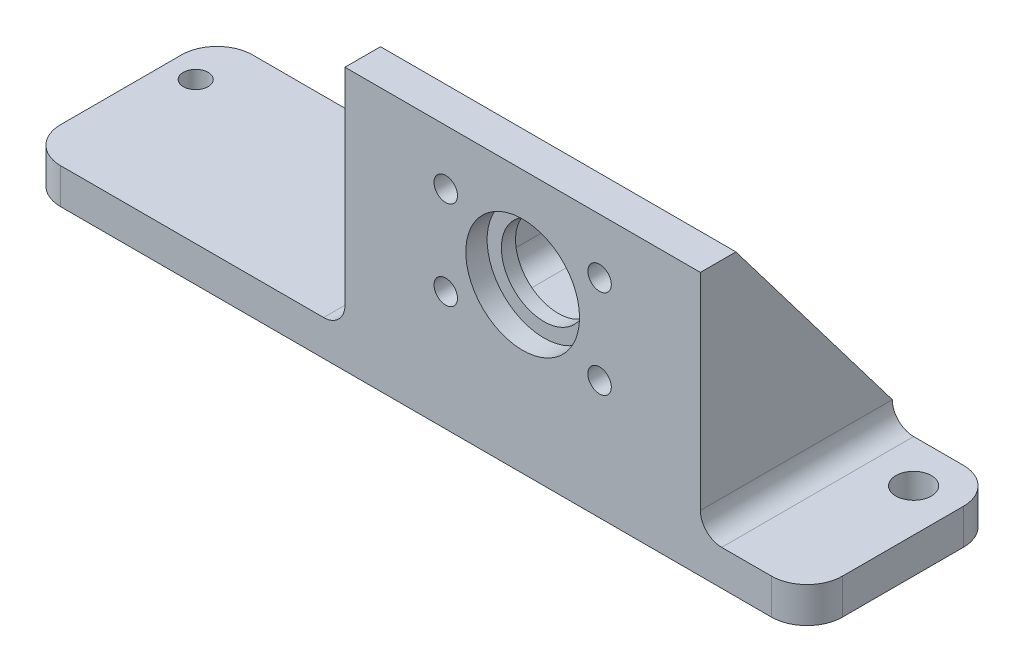
ISO-10303-21;
HEADER;
FILE_DESCRIPTION(('STEP AP214'),'2;1');
FILE_NAME('part.step','',(''),(''),'','','');
FILE_SCHEMA(('AUTOMOTIVE_DESIGN { 1 0 10303 214 1 1 1 1 }'));
ENDSEC;
DATA;
#1=APPLICATION_CONTEXT('core data for automotive mechanical design processes');
#2=APPLICATION_PROTOCOL_DEFINITION('international standard','automotive_design',2000,#1);
#3=PRODUCT_CONTEXT('',#1,'mechanical');
#4=PRODUCT('Part','Part','',(#3));
#5=PRODUCT_RELATED_PRODUCT_CATEGORY('part','',(#4));
#6=PRODUCT_DEFINITION_FORMATION('','',#4);
#7=PRODUCT_DEFINITION_CONTEXT('part definition',#1,'design');
#8=PRODUCT_DEFINITION('design','',#6,#7);
#9=PRODUCT_DEFINITION_SHAPE('','',#8);
#10=(LENGTH_UNIT() NAMED_UNIT(*) SI_UNIT(.MILLI.,.METRE.));
#11=(NAMED_UNIT(*) PLANE_ANGLE_UNIT() SI_UNIT($,.RADIAN.));
#12=(NAMED_UNIT(*) SI_UNIT($,.STERADIAN.) SOLID_ANGLE_UNIT());
#13=UNCERTAINTY_MEASURE_WITH_UNIT(LENGTH_MEASURE(1.E-05),#10,'distance_accuracy_value','');
#14=(GEOMETRIC_REPRESENTATION_CONTEXT(3) GLOBAL_UNCERTAINTY_ASSIGNED_CONTEXT((#13)) GLOBAL_UNIT_ASSIGNED_CONTEXT((#10,
#11,#12)) REPRESENTATION_CONTEXT('',''));
#15=CARTESIAN_POINT('',(0.,0.,0.));
#16=DIRECTION('',(0.,0.,1.));
#17=DIRECTION('',(1.,0.,0.));
#18=AXIS2_PLACEMENT_3D('',#15,#16,#17);
#19=CARTESIAN_POINT('',(-65.,5.,-27.));
#20=DIRECTION('',(0.,1.,0.));
#21=DIRECTION('',(0.,0.,1.));
#22=AXIS2_PLACEMENT_3D('',#19,#20,#21);
#23=PLANE('',#22);
#24=DIRECTION('',(-1.,0.,0.));
#25=VECTOR('',#24,1.);
#26=CARTESIAN_POINT('',(-65.,5.,-32.));
#27=LINE('',#26,#25);
#28=CARTESIAN_POINT('',(35.,5.,-32.));
#29=VERTEX_POINT('',#28);
#30=CARTESIAN_POINT('',(28.,5.,-32.));
#31=VERTEX_POINT('',#30);
#32=EDGE_CURVE('E244',#29,#31,#27,.T.);
#33=ORIENTED_EDGE('',*,*,#32,.T.);
#34=DIRECTION('',(0.,0.,-1.));
#35=VECTOR('',#34,1.);
#36=CARTESIAN_POINT('',(28.,5.,-27.));
#37=LINE('',#36,#35);
#38=CARTESIAN_POINT('',(28.,5.,-5.));
#39=VERTEX_POINT('',#38);
#40=EDGE_CURVE('E334',#31,#39,#37,.F.);
#41=ORIENTED_EDGE('',*,*,#40,.T.);
#42=DIRECTION('',(1.,0.,0.));
#43=VECTOR('',#42,1.);
#44=CARTESIAN_POINT('',(-65.,5.,-5.));
#45=LINE('',#44,#43);
#46=CARTESIAN_POINT('',(35.,5.,-5.));
#47=VERTEX_POINT('',#46);
#48=EDGE_CURVE('E324',#39,#47,#45,.T.);
#49=ORIENTED_EDGE('',*,*,#48,.T.);
#50=CARTESIAN_POINT('',(35.,5.,-10.));
#51=DIRECTION('',(0.,1.,0.));
#52=DIRECTION('',(0.,0.,1.));
#53=AXIS2_PLACEMENT_3D('',#50,#51,#52);
#54=CIRCLE('',#53,5.);
#55=CARTESIAN_POINT('',(40.,5.,-10.));
#56=VERTEX_POINT('',#55);
#57=EDGE_CURVE('E327',#47,#56,#54,.T.);
#58=ORIENTED_EDGE('',*,*,#57,.T.);
#59=DIRECTION('',(0.,0.,-1.));
#60=VECTOR('',#59,1.);
#61=CARTESIAN_POINT('',(40.,5.,-27.));
#62=LINE('',#61,#60);
#63=CARTESIAN_POINT('',(40.,5.,-27.));
#64=VERTEX_POINT('',#63);
#65=EDGE_CURVE('E446',#56,#64,#62,.T.);
#66=ORIENTED_EDGE('',*,*,#65,.T.);
#67=CARTESIAN_POINT('',(35.,5.,-27.));
#68=DIRECTION('',(0.,1.,0.));
#69=DIRECTION('',(0.,0.,1.));
#70=AXIS2_PLACEMENT_3D('',#67,#68,#69);
#71=CIRCLE('',#70,5.);
#72=EDGE_CURVE('E230',#64,#29,#71,.T.);
#73=ORIENTED_EDGE('',*,*,#72,.T.);
#74=EDGE_LOOP('',(#33,#41,#49,#58,#66,#73));
#75=FACE_BOUND('',#74,.T.);
#76=CARTESIAN_POINT('',(34.,5.,-26.));
#77=DIRECTION('',(0.,1.,0.));
#78=DIRECTION('',(0.,0.,1.));
#79=AXIS2_PLACEMENT_3D('',#76,#77,#78);
#80=CIRCLE('',#79,2.5);
#81=CARTESIAN_POINT('',(34.,5.,-23.5));
#82=VERTEX_POINT('',#81);
#83=EDGE_CURVE('E303',#82,#82,#80,.T.);
#84=ORIENTED_EDGE('',*,*,#83,.F.);
#85=EDGE_LOOP('',(#84));
#86=FACE_BOUND('',#85,.T.);
#87=ADVANCED_FACE('F39',(#75,#86),#23,.T.);
#88=CARTESIAN_POINT('',(-65.,5.,-5.));
#89=VERTEX_POINT('',#88);
#90=CARTESIAN_POINT('',(-28.,5.,-5.));
#91=VERTEX_POINT('',#90);
#92=EDGE_CURVE('E248',#89,#91,#45,.T.);
#93=ORIENTED_EDGE('',*,*,#92,.T.);
#94=DIRECTION('',(0.,0.,1.));
#95=VECTOR('',#94,1.);
#96=CARTESIAN_POINT('',(-28.,5.,-27.));
#97=LINE('',#96,#95);
#98=CARTESIAN_POINT('',(-28.,5.,-32.));
#99=VERTEX_POINT('',#98);
#100=EDGE_CURVE('E216',#91,#99,#97,.F.);
#101=ORIENTED_EDGE('',*,*,#100,.T.);
#102=CARTESIAN_POINT('',(-65.,5.,-32.));
#103=VERTEX_POINT('',#102);
#104=EDGE_CURVE('E209',#99,#103,#27,.T.);
#105=ORIENTED_EDGE('',*,*,#104,.T.);
#106=CARTESIAN_POINT('',(-65.,5.,-27.));
#107=DIRECTION('',(0.,1.,0.));
#108=DIRECTION('',(0.,0.,1.));
#109=AXIS2_PLACEMENT_3D('',#106,#107,#108);
#110=CIRCLE('',#109,5.);
#111=CARTESIAN_POINT('',(-70.,5.,-27.));
#112=VERTEX_POINT('',#111);
#113=EDGE_CURVE('E317',#103,#112,#110,.T.);
#114=ORIENTED_EDGE('',*,*,#113,.T.);
#115=DIRECTION('',(0.,0.,1.));
#116=VECTOR('',#115,1.);
#117=CARTESIAN_POINT('',(-70.,5.,-27.));
#118=LINE('',#117,#116);
#119=CARTESIAN_POINT('',(-70.,5.,-10.));
#120=VERTEX_POINT('',#119);
#121=EDGE_CURVE('E320',#112,#120,#118,.T.);
#122=ORIENTED_EDGE('',*,*,#121,.T.);
#123=CARTESIAN_POINT('',(-65.,5.,-10.));
#124=DIRECTION('',(0.,1.,0.));
#125=DIRECTION('',(0.,0.,-1.));
#126=AXIS2_PLACEMENT_3D('',#123,#124,#125);
#127=CIRCLE('',#126,5.);
#128=EDGE_CURVE('E323',#120,#89,#127,.T.);
#129=ORIENTED_EDGE('',*,*,#128,.T.);
#130=EDGE_LOOP('',(#93,#101,#105,#114,#122,#129));
#131=FACE_BOUND('',#130,.T.);
#132=CARTESIAN_POINT('',(-34.,5.,-26.));
#133=DIRECTION('',(0.,1.,0.));
#134=DIRECTION('',(0.,0.,1.));
#135=AXIS2_PLACEMENT_3D('',#132,#133,#134);
#136=CIRCLE('',#135,2.5);
#137=CARTESIAN_POINT('',(-34.,5.,-23.5));
#138=VERTEX_POINT('',#137);
#139=EDGE_CURVE('E309',#138,#138,#136,.T.);
#140=ORIENTED_EDGE('',*,*,#139,.F.);
#141=EDGE_LOOP('',(#140));
#142=FACE_BOUND('',#141,.T.);
#143=CARTESIAN_POINT('',(-66.,5.,-25.));
#144=DIRECTION('',(0.,1.,0.));
#145=DIRECTION('',(0.,0.,1.));
#146=AXIS2_PLACEMENT_3D('',#143,#144,#145);
#147=CIRCLE('',#146,1.75);
#148=CARTESIAN_POINT('',(-66.,5.,-23.25));
#149=VERTEX_POINT('',#148);
#150=EDGE_CURVE('E258',#149,#149,#147,.T.);
#151=ORIENTED_EDGE('',*,*,#150,.F.);
#152=EDGE_LOOP('',(#151));
#153=FACE_BOUND('',#152,.T.);
#154=ADVANCED_FACE('F450',(#131,#142,#153),#23,.T.);
#155=CARTESIAN_POINT('',(-65.,5.,-27.));
#156=DIRECTION('',(0.,-1.,0.));
#157=DIRECTION('',(0.,0.,-1.));
#158=AXIS2_PLACEMENT_3D('',#155,#156,#157);
#159=CYLINDRICAL_SURFACE('',#158,5.);
#160=CARTESIAN_POINT('',(-65.,0.,-27.));
#161=DIRECTION('',(0.,1.,0.));
#162=DIRECTION('',(0.,0.,1.));
#163=AXIS2_PLACEMENT_3D('',#160,#161,#162);
#164=CIRCLE('',#163,5.);
#165=CARTESIAN_POINT('',(-65.,0.,-32.));
#166=VERTEX_POINT('',#165);
#167=CARTESIAN_POINT('',(-70.,0.,-27.));
#168=VERTEX_POINT('',#167);
#169=EDGE_CURVE('E236',#166,#168,#164,.T.);
#170=ORIENTED_EDGE('',*,*,#169,.T.);
#171=DIRECTION('',(0.,-1.,0.));
#172=VECTOR('',#171,1.);
#173=CARTESIAN_POINT('',(-70.,5.,-27.));
#174=LINE('',#173,#172);
#175=EDGE_CURVE('E217',#112,#168,#174,.T.);
#176=ORIENTED_EDGE('',*,*,#175,.F.);
#177=ORIENTED_EDGE('',*,*,#113,.F.);
#178=DIRECTION('',(0.,-1.,0.));
#179=VECTOR('',#178,1.);
#180=CARTESIAN_POINT('',(-65.,5.,-32.));
#181=LINE('',#180,#179);
#182=EDGE_CURVE('E247',#103,#166,#181,.T.);
#183=ORIENTED_EDGE('',*,*,#182,.T.);
#184=EDGE_LOOP('',(#170,#176,#177,#183));
#185=FACE_BOUND('',#184,.T.);
#186=ADVANCED_FACE('F494',(#185),#159,.T.);
#187=CARTESIAN_POINT('',(-70.,5.,-27.));
#188=DIRECTION('',(1.,0.,0.));
#189=DIRECTION('',(0.,0.,-1.));
#190=AXIS2_PLACEMENT_3D('',#187,#188,#189);
#191=PLANE('',#190);
#192=DIRECTION('',(0.,0.,1.));
#193=VECTOR('',#192,1.);
#194=CARTESIAN_POINT('',(-70.,0.,-27.));
#195=LINE('',#194,#193);
#196=CARTESIAN_POINT('',(-70.,0.,-10.));
#197=VERTEX_POINT('',#196);
#198=EDGE_CURVE('E842',#168,#197,#195,.T.);
#199=ORIENTED_EDGE('',*,*,#198,.T.);
#200=DIRECTION('',(0.,-1.,0.));
#201=VECTOR('',#200,1.);
#202=CARTESIAN_POINT('',(-70.,5.,-10.));
#203=LINE('',#202,#201);
#204=EDGE_CURVE('E222',#120,#197,#203,.T.);
#205=ORIENTED_EDGE('',*,*,#204,.F.);
#206=ORIENTED_EDGE('',*,*,#121,.F.);
#207=ORIENTED_EDGE('',*,*,#175,.T.);
#208=EDGE_LOOP('',(#199,#205,#206,#207));
#209=FACE_BOUND('',#208,.T.);
#210=ADVANCED_FACE('F498',(#209),#191,.F.);
#211=CARTESIAN_POINT('',(-65.,5.,-10.));
#212=DIRECTION('',(0.,-1.,0.));
#213=DIRECTION('',(0.,0.,-1.));
#214=AXIS2_PLACEMENT_3D('',#211,#212,#213);
#215=CYLINDRICAL_SURFACE('',#214,5.);
#216=CARTESIAN_POINT('',(-65.,0.,-10.));
#217=DIRECTION('',(0.,1.,0.));
#218=DIRECTION('',(0.,0.,-1.));
#219=AXIS2_PLACEMENT_3D('',#216,#217,#218);
#220=CIRCLE('',#219,5.);
#221=CARTESIAN_POINT('',(-65.,0.,-5.));
#222=VERTEX_POINT('',#221);
#223=EDGE_CURVE('E845',#197,#222,#220,.T.);
#224=ORIENTED_EDGE('',*,*,#223,.T.);
#225=DIRECTION('',(0.,-1.,0.));
#226=VECTOR('',#225,1.);
#227=CARTESIAN_POINT('',(-65.,5.,-5.));
#228=LINE('',#227,#226);
#229=EDGE_CURVE('E439',#89,#222,#228,.T.);
#230=ORIENTED_EDGE('',*,*,#229,.F.);
#231=ORIENTED_EDGE('',*,*,#128,.F.);
#232=ORIENTED_EDGE('',*,*,#204,.T.);
#233=EDGE_LOOP('',(#224,#230,#231,#232));
#234=FACE_BOUND('',#233,.T.);
#235=ADVANCED_FACE('F504',(#234),#215,.T.);
#236=CARTESIAN_POINT('',(-65.,5.,-5.));
#237=DIRECTION('',(0.,0.,-1.));
#238=DIRECTION('',(-1.,0.,0.));
#239=AXIS2_PLACEMENT_3D('',#236,#237,#238);
#240=PLANE('',#239);
#241=CARTESIAN_POINT('',(-0.00088608821802426,23.,-5.));
#242=DIRECTION('',(0.,0.,1.));
#243=DIRECTION('',(1.,0.,0.));
#244=AXIS2_PLACEMENT_3D('',#241,#242,#243);
#245=CIRCLE('',#244,8.);
#246=CARTESIAN_POINT('',(7.99911391178197,23.,-5.));
#247=VERTEX_POINT('',#246);
#248=EDGE_CURVE('E359',#247,#247,#245,.T.);
#249=ORIENTED_EDGE('',*,*,#248,.F.);
#250=EDGE_LOOP('',(#249));
#251=FACE_BOUND('',#250,.T.);
#252=CARTESIAN_POINT('',(10.82,16.75,-5.));
#253=DIRECTION('',(0.,0.,1.));
#254=DIRECTION('',(1.,0.,0.));
#255=AXIS2_PLACEMENT_3D('',#252,#253,#254);
#256=CIRCLE('',#255,1.65);
#257=CARTESIAN_POINT('',(12.47,16.75,-5.));
#258=VERTEX_POINT('',#257);
#259=EDGE_CURVE('E275',#258,#258,#256,.T.);
#260=ORIENTED_EDGE('',*,*,#259,.F.);
#261=EDGE_LOOP('',(#260));
#262=FACE_BOUND('',#261,.T.);
#263=CARTESIAN_POINT('',(-10.82,16.75,-5.));
#264=DIRECTION('',(0.,0.,1.));
#265=DIRECTION('',(1.,0.,0.));
#266=AXIS2_PLACEMENT_3D('',#263,#264,#265);
#267=CIRCLE('',#266,1.65);
#268=CARTESIAN_POINT('',(-9.17,16.75,-5.));
#269=VERTEX_POINT('',#268);
#270=EDGE_CURVE('E272',#269,#269,#267,.T.);
#271=ORIENTED_EDGE('',*,*,#270,.F.);
#272=EDGE_LOOP('',(#271));
#273=FACE_BOUND('',#272,.T.);
#274=CARTESIAN_POINT('',(10.82,29.25,-5.));
#275=DIRECTION('',(0.,0.,1.));
#276=DIRECTION('',(1.,0.,0.));
#277=AXIS2_PLACEMENT_3D('',#274,#275,#276);
#278=CIRCLE('',#277,1.65);
#279=CARTESIAN_POINT('',(12.47,29.25,-5.));
#280=VERTEX_POINT('',#279);
#281=EDGE_CURVE('E269',#280,#280,#278,.T.);
#282=ORIENTED_EDGE('',*,*,#281,.F.);
#283=EDGE_LOOP('',(#282));
#284=FACE_BOUND('',#283,.T.);
#285=CARTESIAN_POINT('',(-10.82,29.25,-5.));
#286=DIRECTION('',(0.,0.,1.));
#287=DIRECTION('',(1.,0.,0.));
#288=AXIS2_PLACEMENT_3D('',#285,#286,#287);
#289=CIRCLE('',#288,1.65);
#290=CARTESIAN_POINT('',(-9.17,29.25,-5.));
#291=VERTEX_POINT('',#290);
#292=EDGE_CURVE('E265',#291,#291,#289,.T.);
#293=ORIENTED_EDGE('',*,*,#292,.F.);
#294=EDGE_LOOP('',(#293));
#295=FACE_BOUND('',#294,.T.);
#296=DIRECTION('',(1.,0.,0.));
#297=VECTOR('',#296,1.);
#298=CARTESIAN_POINT('',(-65.,0.,-5.));
#299=LINE('',#298,#297);
#300=CARTESIAN_POINT('',(35.,0.,-5.));
#301=VERTEX_POINT('',#300);
#302=EDGE_CURVE('E436',#222,#301,#299,.T.);
#303=ORIENTED_EDGE('',*,*,#302,.T.);
#304=DIRECTION('',(0.,-1.,0.));
#305=VECTOR('',#304,1.);
#306=CARTESIAN_POINT('',(35.,5.,-5.));
#307=LINE('',#306,#305);
#308=EDGE_CURVE('E432',#47,#301,#307,.T.);
#309=ORIENTED_EDGE('',*,*,#308,.F.);
#310=ORIENTED_EDGE('',*,*,#48,.F.);
#311=CARTESIAN_POINT('',(28.,8.,-5.));
#312=DIRECTION('',(0.,0.,-1.));
#313=DIRECTION('',(-1.,0.,0.));
#314=AXIS2_PLACEMENT_3D('',#311,#312,#313);
#315=CIRCLE('',#314,3.);
#316=CARTESIAN_POINT('',(25.,8.,-5.));
#317=VERTEX_POINT('',#316);
#318=EDGE_CURVE('E11',#39,#317,#315,.T.);
#319=ORIENTED_EDGE('',*,*,#318,.T.);
#320=DIRECTION('',(0.,-1.,0.));
#321=VECTOR('',#320,1.);
#322=CARTESIAN_POINT('',(25.,37.,-5.));
#323=LINE('',#322,#321);
#324=CARTESIAN_POINT('',(25.,37.,-5.));
#325=VERTEX_POINT('',#324);
#326=EDGE_CURVE('E250',#325,#317,#323,.T.);
#327=ORIENTED_EDGE('',*,*,#326,.F.);
#328=DIRECTION('',(1.,0.,0.));
#329=VECTOR('',#328,1.);
#330=CARTESIAN_POINT('',(-25.,37.,-5.));
#331=LINE('',#330,#329);
#332=CARTESIAN_POINT('',(-25.,37.,-5.));
#333=VERTEX_POINT('',#332);
#334=EDGE_CURVE('E296',#333,#325,#331,.T.);
#335=ORIENTED_EDGE('',*,*,#334,.F.);
#336=DIRECTION('',(0.,-1.,0.));
#337=VECTOR('',#336,1.);
#338=CARTESIAN_POINT('',(-25.,37.,-5.));
#339=LINE('',#338,#337);
#340=CARTESIAN_POINT('',(-25.,8.,-5.));
#341=VERTEX_POINT('',#340);
#342=EDGE_CURVE('E253',#333,#341,#339,.T.);
#343=ORIENTED_EDGE('',*,*,#342,.T.);
#344=CARTESIAN_POINT('',(-28.,8.,-5.));
#345=DIRECTION('',(0.,0.,-1.));
#346=DIRECTION('',(-1.,0.,0.));
#347=AXIS2_PLACEMENT_3D('',#344,#345,#346);
#348=CIRCLE('',#347,3.);
#349=EDGE_CURVE('E213',#341,#91,#348,.T.);
#350=ORIENTED_EDGE('',*,*,#349,.T.);
#351=ORIENTED_EDGE('',*,*,#92,.F.);
#352=ORIENTED_EDGE('',*,*,#229,.T.);
#353=EDGE_LOOP('',(#303,#309,#310,#319,#327,#335,#343,#350,#351,#352));
#354=FACE_BOUND('',#353,.T.);
#355=ADVANCED_FACE('F430',(#251,#262,#273,#284,#295,#354),#240,.F.);
#356=CARTESIAN_POINT('',(35.,5.,-10.));
#357=DIRECTION('',(0.,-1.,0.));
#358=DIRECTION('',(0.,0.,-1.));
#359=AXIS2_PLACEMENT_3D('',#356,#357,#358);
#360=CYLINDRICAL_SURFACE('',#359,5.);
#361=CARTESIAN_POINT('',(35.,0.,-10.));
#362=DIRECTION('',(0.,1.,0.));
#363=DIRECTION('',(0.,0.,1.));
#364=AXIS2_PLACEMENT_3D('',#361,#362,#363);
#365=CIRCLE('',#364,5.);
#366=CARTESIAN_POINT('',(40.,0.,-10.));
#367=VERTEX_POINT('',#366);
#368=EDGE_CURVE('E851',#301,#367,#365,.T.);
#369=ORIENTED_EDGE('',*,*,#368,.T.);
#370=DIRECTION('',(0.,-1.,0.));
#371=VECTOR('',#370,1.);
#372=CARTESIAN_POINT('',(40.,5.,-10.));
#373=LINE('',#372,#371);
#374=EDGE_CURVE('E440',#56,#367,#373,.T.);
#375=ORIENTED_EDGE('',*,*,#374,.F.);
#376=ORIENTED_EDGE('',*,*,#57,.F.);
#377=ORIENTED_EDGE('',*,*,#308,.T.);
#378=EDGE_LOOP('',(#369,#375,#376,#377));
#379=FACE_BOUND('',#378,.T.);
#380=ADVANCED_FACE('F443',(#379),#360,.T.);
#381=CARTESIAN_POINT('',(40.,5.,-27.));
#382=DIRECTION('',(-1.,0.,0.));
#383=DIRECTION('',(0.,0.,1.));
#384=AXIS2_PLACEMENT_3D('',#381,#382,#383);
#385=PLANE('',#384);
#386=DIRECTION('',(0.,0.,-1.));
#387=VECTOR('',#386,1.);
#388=CARTESIAN_POINT('',(40.,0.,-27.));
#389=LINE('',#388,#387);
#390=CARTESIAN_POINT('',(40.,0.,-27.));
#391=VERTEX_POINT('',#390);
#392=EDGE_CURVE('E853',#367,#391,#389,.T.);
#393=ORIENTED_EDGE('',*,*,#392,.T.);
#394=DIRECTION('',(0.,-1.,0.));
#395=VECTOR('',#394,1.);
#396=CARTESIAN_POINT('',(40.,5.,-27.));
#397=LINE('',#396,#395);
#398=EDGE_CURVE('E862',#64,#391,#397,.T.);
#399=ORIENTED_EDGE('',*,*,#398,.F.);
#400=ORIENTED_EDGE('',*,*,#65,.F.);
#401=ORIENTED_EDGE('',*,*,#374,.T.);
#402=EDGE_LOOP('',(#393,#399,#400,#401));
#403=FACE_BOUND('',#402,.T.);
#404=ADVANCED_FACE('F717',(#403),#385,.F.);
#405=CARTESIAN_POINT('',(35.,5.,-27.));
#406=DIRECTION('',(0.,-1.,0.));
#407=DIRECTION('',(0.,0.,-1.));
#408=AXIS2_PLACEMENT_3D('',#405,#406,#407);
#409=CYLINDRICAL_SURFACE('',#408,5.);
#410=CARTESIAN_POINT('',(35.,0.,-27.));
#411=DIRECTION('',(0.,1.,0.));
#412=DIRECTION('',(0.,0.,1.));
#413=AXIS2_PLACEMENT_3D('',#410,#411,#412);
#414=CIRCLE('',#413,5.);
#415=CARTESIAN_POINT('',(35.,0.,-32.));
#416=VERTEX_POINT('',#415);
#417=EDGE_CURVE('E855',#391,#416,#414,.T.);
#418=ORIENTED_EDGE('',*,*,#417,.T.);
#419=DIRECTION('',(0.,-1.,0.));
#420=VECTOR('',#419,1.);
#421=CARTESIAN_POINT('',(35.,5.,-32.));
#422=LINE('',#421,#420);
#423=EDGE_CURVE('E859',#29,#416,#422,.T.);
#424=ORIENTED_EDGE('',*,*,#423,.F.);
#425=ORIENTED_EDGE('',*,*,#72,.F.);
#426=ORIENTED_EDGE('',*,*,#398,.T.);
#427=EDGE_LOOP('',(#418,#424,#425,#426));
#428=FACE_BOUND('',#427,.T.);
#429=ADVANCED_FACE('F489',(#428),#409,.T.);
#430=CARTESIAN_POINT('',(-65.,5.,-32.));
#431=DIRECTION('',(0.,0.,1.));
#432=DIRECTION('',(1.,0.,0.));
#433=AXIS2_PLACEMENT_3D('',#430,#431,#432);
#434=PLANE('',#433);
#435=CARTESIAN_POINT('',(-28.,8.,-32.));
#436=DIRECTION('',(0.,0.,1.));
#437=DIRECTION('',(1.,0.,0.));
#438=AXIS2_PLACEMENT_3D('',#435,#436,#437);
#439=CIRCLE('',#438,3.);
#440=CARTESIAN_POINT('',(-25.,8.,-32.));
#441=VERTEX_POINT('',#440);
#442=EDGE_CURVE('E206',#99,#441,#439,.T.);
#443=ORIENTED_EDGE('',*,*,#442,.T.);
#444=DIRECTION('',(-1.,0.,0.));
#445=VECTOR('',#444,1.);
#446=CARTESIAN_POINT('',(40.,8.,-32.));
#447=LINE('',#446,#445);
#448=CARTESIAN_POINT('',(-19.9861679783724,8.,-32.));
#449=VERTEX_POINT('',#448);
#450=EDGE_CURVE('E183',#449,#441,#447,.T.);
#451=ORIENTED_EDGE('',*,*,#450,.F.);
#452=CARTESIAN_POINT('',(-16.9861679783724,8.,-32.));
#453=DIRECTION('',(0.,0.,1.));
#454=DIRECTION('',(1.,0.,0.));
#455=AXIS2_PLACEMENT_3D('',#452,#453,#454);
#456=CIRCLE('',#455,3.);
#457=CARTESIAN_POINT('',(-16.9861679783724,5.,-32.));
#458=VERTEX_POINT('',#457);
#459=EDGE_CURVE('E212',#449,#458,#456,.T.);
#460=ORIENTED_EDGE('',*,*,#459,.T.);
#461=CARTESIAN_POINT('',(16.3831370479905,5.,-32.));
#462=VERTEX_POINT('',#461);
#463=EDGE_CURVE('E229',#462,#458,#27,.T.);
#464=ORIENTED_EDGE('',*,*,#463,.F.);
#465=CARTESIAN_POINT('',(16.3831370479905,8.,-32.));
#466=DIRECTION('',(0.,0.,1.));
#467=DIRECTION('',(1.,0.,0.));
#468=AXIS2_PLACEMENT_3D('',#465,#466,#467);
#469=CIRCLE('',#468,3.);
#470=CARTESIAN_POINT('',(19.3831370479904,8.,-32.));
#471=VERTEX_POINT('',#470);
#472=EDGE_CURVE('E338',#462,#471,#469,.T.);
#473=ORIENTED_EDGE('',*,*,#472,.T.);
#474=CARTESIAN_POINT('',(25.,8.,-32.));
#475=VERTEX_POINT('',#474);
#476=EDGE_CURVE('E192',#475,#471,#447,.T.);
#477=ORIENTED_EDGE('',*,*,#476,.F.);
#478=CARTESIAN_POINT('',(28.,8.,-32.));
#479=DIRECTION('',(0.,0.,1.));
#480=DIRECTION('',(1.,0.,0.));
#481=AXIS2_PLACEMENT_3D('',#478,#479,#480);
#482=CIRCLE('',#481,3.);
#483=EDGE_CURVE('E48',#475,#31,#482,.T.);
#484=ORIENTED_EDGE('',*,*,#483,.T.);
#485=ORIENTED_EDGE('',*,*,#32,.F.);
#486=ORIENTED_EDGE('',*,*,#423,.T.);
#487=DIRECTION('',(-1.,0.,0.));
#488=VECTOR('',#487,1.);
#489=CARTESIAN_POINT('',(-65.,0.,-32.));
#490=LINE('',#489,#488);
#491=EDGE_CURVE('E321',#416,#166,#490,.T.);
#492=ORIENTED_EDGE('',*,*,#491,.T.);
#493=ORIENTED_EDGE('',*,*,#182,.F.);
#494=ORIENTED_EDGE('',*,*,#104,.F.);
#495=EDGE_LOOP('',(#443,#451,#460,#464,#473,#477,#484,#485,#486,#492,#493,#494));
#496=FACE_BOUND('',#495,.T.);
#497=ADVANCED_FACE('F207',(#496),#434,.F.);
#498=ORIENTED_EDGE('',*,*,#463,.T.);
#499=DIRECTION('',(0.,0.,-1.));
#500=VECTOR('',#499,1.);
#501=CARTESIAN_POINT('',(-16.9861679783724,5.,-27.));
#502=LINE('',#501,#500);
#503=CARTESIAN_POINT('',(-16.9861679783724,5.,-13.));
#504=VERTEX_POINT('',#503);
#505=EDGE_CURVE('E413',#458,#504,#502,.F.);
#506=ORIENTED_EDGE('',*,*,#505,.T.);
#507=DIRECTION('',(-1.,0.,0.));
#508=VECTOR('',#507,1.);
#509=CARTESIAN_POINT('',(-65.,5.,-13.));
#510=LINE('',#509,#508);
#511=CARTESIAN_POINT('',(16.3831370479905,5.,-13.));
#512=VERTEX_POINT('',#511);
#513=EDGE_CURVE('E406',#504,#512,#510,.F.);
#514=ORIENTED_EDGE('',*,*,#513,.T.);
#515=DIRECTION('',(0.,0.,1.));
#516=VECTOR('',#515,1.);
#517=CARTESIAN_POINT('',(16.3831370479905,5.,-27.));
#518=LINE('',#517,#516);
#519=EDGE_CURVE('E410',#512,#462,#518,.F.);
#520=ORIENTED_EDGE('',*,*,#519,.T.);
#521=EDGE_LOOP('',(#498,#506,#514,#520));
#522=FACE_BOUND('',#521,.T.);
#523=ADVANCED_FACE('F478',(#522),#23,.T.);
#524=CARTESIAN_POINT('',(-65.,0.,-27.));
#525=DIRECTION('',(0.,1.,0.));
#526=DIRECTION('',(0.,0.,1.));
#527=AXIS2_PLACEMENT_3D('',#524,#525,#526);
#528=PLANE('',#527);
#529=CARTESIAN_POINT('',(-66.,0.,-25.));
#530=DIRECTION('',(0.,1.,0.));
#531=DIRECTION('',(0.,0.,1.));
#532=AXIS2_PLACEMENT_3D('',#529,#530,#531);
#533=CIRCLE('',#532,1.75);
#534=CARTESIAN_POINT('',(-66.,0.,-23.25));
#535=VERTEX_POINT('',#534);
#536=EDGE_CURVE('E300',#535,#535,#533,.T.);
#537=ORIENTED_EDGE('',*,*,#536,.T.);
#538=EDGE_LOOP('',(#537));
#539=FACE_BOUND('',#538,.T.);
#540=CARTESIAN_POINT('',(34.,0.,-26.));
#541=DIRECTION('',(0.,1.,0.));
#542=DIRECTION('',(0.,0.,1.));
#543=AXIS2_PLACEMENT_3D('',#540,#541,#542);
#544=CIRCLE('',#543,2.5);
#545=CARTESIAN_POINT('',(34.,0.,-23.5));
#546=VERTEX_POINT('',#545);
#547=EDGE_CURVE('E306',#546,#546,#544,.T.);
#548=ORIENTED_EDGE('',*,*,#547,.T.);
#549=EDGE_LOOP('',(#548));
#550=FACE_BOUND('',#549,.T.);
#551=CARTESIAN_POINT('',(-34.,0.,-26.));
#552=DIRECTION('',(0.,1.,0.));
#553=DIRECTION('',(0.,0.,1.));
#554=AXIS2_PLACEMENT_3D('',#551,#552,#553);
#555=CIRCLE('',#554,2.5);
#556=CARTESIAN_POINT('',(-34.,0.,-23.5));
#557=VERTEX_POINT('',#556);
#558=EDGE_CURVE('E312',#557,#557,#555,.T.);
#559=ORIENTED_EDGE('',*,*,#558,.T.);
#560=EDGE_LOOP('',(#559));
#561=FACE_BOUND('',#560,.T.);
#562=ORIENTED_EDGE('',*,*,#169,.F.);
#563=ORIENTED_EDGE('',*,*,#491,.F.);
#564=ORIENTED_EDGE('',*,*,#417,.F.);
#565=ORIENTED_EDGE('',*,*,#392,.F.);
#566=ORIENTED_EDGE('',*,*,#368,.F.);
#567=ORIENTED_EDGE('',*,*,#302,.F.);
#568=ORIENTED_EDGE('',*,*,#223,.F.);
#569=ORIENTED_EDGE('',*,*,#198,.F.);
#570=EDGE_LOOP('',(#562,#563,#564,#565,#566,#567,#568,#569));
#571=FACE_BOUND('',#570,.T.);
#572=ADVANCED_FACE('F480',(#539,#550,#561,#571),#528,.F.);
#573=CARTESIAN_POINT('',(-34.,0.,-26.));
#574=DIRECTION('',(0.,1.,0.));
#575=DIRECTION('',(0.,0.,1.));
#576=AXIS2_PLACEMENT_3D('',#573,#574,#575);
#577=CYLINDRICAL_SURFACE('',#576,2.5);
#578=ORIENTED_EDGE('',*,*,#558,.F.);
#579=EDGE_LOOP('',(#578));
#580=FACE_BOUND('',#579,.T.);
#581=ORIENTED_EDGE('',*,*,#139,.T.);
#582=EDGE_LOOP('',(#581));
#583=FACE_BOUND('',#582,.T.);
#584=ADVANCED_FACE('F486',(#580,#583),#577,.F.);
#585=CARTESIAN_POINT('',(34.,0.,-26.));
#586=DIRECTION('',(0.,1.,0.));
#587=DIRECTION('',(0.,0.,1.));
#588=AXIS2_PLACEMENT_3D('',#585,#586,#587);
#589=CYLINDRICAL_SURFACE('',#588,2.5);
#590=ORIENTED_EDGE('',*,*,#547,.F.);
#591=EDGE_LOOP('',(#590));
#592=FACE_BOUND('',#591,.T.);
#593=ORIENTED_EDGE('',*,*,#83,.T.);
#594=EDGE_LOOP('',(#593));
#595=FACE_BOUND('',#594,.T.);
#596=ADVANCED_FACE('F787',(#592,#595),#589,.F.);
#597=CARTESIAN_POINT('',(-66.,0.,-25.));
#598=DIRECTION('',(0.,1.,0.));
#599=DIRECTION('',(0.,0.,1.));
#600=AXIS2_PLACEMENT_3D('',#597,#598,#599);
#601=CYLINDRICAL_SURFACE('',#600,1.75);
#602=ORIENTED_EDGE('',*,*,#536,.F.);
#603=EDGE_LOOP('',(#602));
#604=FACE_BOUND('',#603,.T.);
#605=ORIENTED_EDGE('',*,*,#150,.T.);
#606=EDGE_LOOP('',(#605));
#607=FACE_BOUND('',#606,.T.);
#608=ADVANCED_FACE('F701',(#604,#607),#601,.F.);
#609=CARTESIAN_POINT('',(19.3831370479905,37.,-10.));
#610=DIRECTION('',(0.,0.,1.));
#611=DIRECTION('',(1.,0.,0.));
#612=AXIS2_PLACEMENT_3D('',#609,#610,#611);
#613=PLANE('',#612);
#614=DIRECTION('',(-1.,0.,0.));
#615=VECTOR('',#614,1.);
#616=CARTESIAN_POINT('',(19.3831370479905,37.,-10.));
#617=LINE('',#616,#615);
#618=CARTESIAN_POINT('',(16.3831370479905,37.,-10.));
#619=VERTEX_POINT('',#618);
#620=CARTESIAN_POINT('',(-16.9861679783724,37.,-10.));
#621=VERTEX_POINT('',#620);
#622=EDGE_CURVE('E264',#619,#621,#617,.T.);
#623=ORIENTED_EDGE('',*,*,#622,.F.);
#624=DIRECTION('',(0.,-1.,0.));
#625=VECTOR('',#624,1.);
#626=CARTESIAN_POINT('',(16.3831370479905,5.,-10.));
#627=LINE('',#626,#625);
#628=CARTESIAN_POINT('',(16.3831370479905,8.,-10.));
#629=VERTEX_POINT('',#628);
#630=EDGE_CURVE('E396',#619,#629,#627,.T.);
#631=ORIENTED_EDGE('',*,*,#630,.T.);
#632=DIRECTION('',(-1.,0.,0.));
#633=VECTOR('',#632,1.);
#634=CARTESIAN_POINT('',(19.3831370479905,8.,-10.));
#635=LINE('',#634,#633);
#636=CARTESIAN_POINT('',(-16.9861679783724,8.,-10.));
#637=VERTEX_POINT('',#636);
#638=EDGE_CURVE('E219',#629,#637,#635,.T.);
#639=ORIENTED_EDGE('',*,*,#638,.T.);
#640=DIRECTION('',(0.,-1.,0.));
#641=VECTOR('',#640,1.);
#642=CARTESIAN_POINT('',(-16.9861679783724,37.,-10.));
#643=LINE('',#642,#641);
#644=EDGE_CURVE('E401',#637,#621,#643,.F.);
#645=ORIENTED_EDGE('',*,*,#644,.T.);
#646=EDGE_LOOP('',(#623,#631,#639,#645));
#647=FACE_BOUND('',#646,.T.);
#648=CARTESIAN_POINT('',(-0.00088608821802426,23.,-10.));
#649=DIRECTION('',(0.,0.,1.));
#650=DIRECTION('',(1.,0.,0.));
#651=AXIS2_PLACEMENT_3D('',#648,#649,#650);
#652=CIRCLE('',#651,6.);
#653=CARTESIAN_POINT('',(5.99911391178197,23.,-10.));
#654=VERTEX_POINT('',#653);
#655=EDGE_CURVE('E226',#654,#654,#652,.T.);
#656=ORIENTED_EDGE('',*,*,#655,.T.);
#657=EDGE_LOOP('',(#656));
#658=FACE_BOUND('',#657,.T.);
#659=CARTESIAN_POINT('',(10.82,16.75,-10.));
#660=DIRECTION('',(0.,0.,1.));
#661=DIRECTION('',(1.,0.,0.));
#662=AXIS2_PLACEMENT_3D('',#659,#660,#661);
#663=CIRCLE('',#662,1.65);
#664=CARTESIAN_POINT('',(12.47,16.75,-10.));
#665=VERTEX_POINT('',#664);
#666=EDGE_CURVE('E273',#665,#665,#663,.T.);
#667=ORIENTED_EDGE('',*,*,#666,.T.);
#668=EDGE_LOOP('',(#667));
#669=FACE_BOUND('',#668,.T.);
#670=CARTESIAN_POINT('',(-10.82,16.75,-10.));
#671=DIRECTION('',(0.,0.,1.));
#672=DIRECTION('',(1.,0.,0.));
#673=AXIS2_PLACEMENT_3D('',#670,#671,#672);
#674=CIRCLE('',#673,1.65);
#675=CARTESIAN_POINT('',(-9.17,16.75,-10.));
#676=VERTEX_POINT('',#675);
#677=EDGE_CURVE('E270',#676,#676,#674,.T.);
#678=ORIENTED_EDGE('',*,*,#677,.T.);
#679=EDGE_LOOP('',(#678));
#680=FACE_BOUND('',#679,.T.);
#681=CARTESIAN_POINT('',(10.82,29.25,-10.));
#682=DIRECTION('',(0.,0.,1.));
#683=DIRECTION('',(1.,0.,0.));
#684=AXIS2_PLACEMENT_3D('',#681,#682,#683);
#685=CIRCLE('',#684,1.65);
#686=CARTESIAN_POINT('',(12.47,29.25,-10.));
#687=VERTEX_POINT('',#686);
#688=EDGE_CURVE('E266',#687,#687,#685,.T.);
#689=ORIENTED_EDGE('',*,*,#688,.T.);
#690=EDGE_LOOP('',(#689));
#691=FACE_BOUND('',#690,.T.);
#692=CARTESIAN_POINT('',(-10.82,29.25,-10.));
#693=DIRECTION('',(0.,0.,1.));
#694=DIRECTION('',(1.,0.,0.));
#695=AXIS2_PLACEMENT_3D('',#692,#693,#694);
#696=CIRCLE('',#695,1.65);
#697=CARTESIAN_POINT('',(-9.17,29.25,-10.));
#698=VERTEX_POINT('',#697);
#699=EDGE_CURVE('E261',#698,#698,#696,.T.);
#700=ORIENTED_EDGE('',*,*,#699,.T.);
#701=EDGE_LOOP('',(#700));
#702=FACE_BOUND('',#701,.T.);
#703=ADVANCED_FACE('F460',(#647,#658,#669,#680,#691,#702),#613,.F.);
#704=CARTESIAN_POINT('',(-19.9861679783724,37.,-32.));
#705=DIRECTION('',(-1.,0.,0.));
#706=DIRECTION('',(0.,0.,1.));
#707=AXIS2_PLACEMENT_3D('',#704,#705,#706);
#708=PLANE('',#707);
#709=DIRECTION('',(0.,0.,-1.));
#710=VECTOR('',#709,1.);
#711=CARTESIAN_POINT('',(-19.9861679783724,8.,-32.));
#712=LINE('',#711,#710);
#713=CARTESIAN_POINT('',(-19.9861679783724,8.,-13.));
#714=VERTEX_POINT('',#713);
#715=EDGE_CURVE('E398',#714,#449,#712,.T.);
#716=ORIENTED_EDGE('',*,*,#715,.T.);
#717=DIRECTION('',(0.,0.796691270902397,0.604386481374232));
#718=VECTOR('',#717,1.);
#719=CARTESIAN_POINT('',(-19.9861679783724,26.4067924528302,-18.0362264150943));
#720=LINE('',#719,#718);
#721=CARTESIAN_POINT('',(-19.9861679783724,33.0454545454545,-13.));
#722=VERTEX_POINT('',#721);
#723=EDGE_CURVE('E189',#449,#722,#720,.T.);
#724=ORIENTED_EDGE('',*,*,#723,.T.);
#725=DIRECTION('',(0.,-1.,0.));
#726=VECTOR('',#725,1.);
#727=CARTESIAN_POINT('',(-19.9861679783724,5.,-13.));
#728=LINE('',#727,#726);
#729=EDGE_CURVE('E405',#722,#714,#728,.T.);
#730=ORIENTED_EDGE('',*,*,#729,.T.);
#731=EDGE_LOOP('',(#716,#724,#730));
#732=FACE_BOUND('',#731,.T.);
#733=ADVANCED_FACE('F474',(#732),#708,.F.);
#734=CARTESIAN_POINT('',(-25.,37.,-5.));
#735=DIRECTION('',(1.,0.,0.));
#736=DIRECTION('',(0.,0.,-1.));
#737=AXIS2_PLACEMENT_3D('',#734,#735,#736);
#738=PLANE('',#737);
#739=DIRECTION('',(0.,0.,1.));
#740=VECTOR('',#739,1.);
#741=CARTESIAN_POINT('',(-25.,37.,-5.));
#742=LINE('',#741,#740);
#743=CARTESIAN_POINT('',(-25.,37.,-10.));
#744=VERTEX_POINT('',#743);
#745=EDGE_CURVE('E202',#744,#333,#742,.T.);
#746=ORIENTED_EDGE('',*,*,#745,.F.);
#747=DIRECTION('',(0.,0.796691270902396,0.604386481374232));
#748=VECTOR('',#747,1.);
#749=CARTESIAN_POINT('',(-25.,37.,-10.));
#750=LINE('',#749,#748);
#751=EDGE_CURVE('E186',#441,#744,#750,.T.);
#752=ORIENTED_EDGE('',*,*,#751,.F.);
#753=DIRECTION('',(0.,0.,1.));
#754=VECTOR('',#753,1.);
#755=CARTESIAN_POINT('',(-25.,8.,-5.));
#756=LINE('',#755,#754);
#757=EDGE_CURVE('E200',#441,#341,#756,.T.);
#758=ORIENTED_EDGE('',*,*,#757,.T.);
#759=ORIENTED_EDGE('',*,*,#342,.F.);
#760=EDGE_LOOP('',(#746,#752,#758,#759));
#761=FACE_BOUND('',#760,.T.);
#762=ADVANCED_FACE('F197',(#761),#738,.F.);
#763=CARTESIAN_POINT('',(25.,37.,-5.));
#764=DIRECTION('',(-1.,0.,0.));
#765=DIRECTION('',(0.,0.,1.));
#766=AXIS2_PLACEMENT_3D('',#763,#764,#765);
#767=PLANE('',#766);
#768=DIRECTION('',(0.,0.,-1.));
#769=VECTOR('',#768,1.);
#770=CARTESIAN_POINT('',(25.,8.,-5.));
#771=LINE('',#770,#769);
#772=EDGE_CURVE('E332',#317,#475,#771,.T.);
#773=ORIENTED_EDGE('',*,*,#772,.T.);
#774=DIRECTION('',(0.,0.796691270902397,0.604386481374232));
#775=VECTOR('',#774,1.);
#776=CARTESIAN_POINT('',(25.,39.4075471698113,-8.17358490566038));
#777=LINE('',#776,#775);
#778=CARTESIAN_POINT('',(25.,37.,-10.));
#779=VERTEX_POINT('',#778);
#780=EDGE_CURVE('E345',#475,#779,#777,.T.);
#781=ORIENTED_EDGE('',*,*,#780,.T.);
#782=DIRECTION('',(0.,0.,-1.));
#783=VECTOR('',#782,1.);
#784=CARTESIAN_POINT('',(25.,37.,-5.));
#785=LINE('',#784,#783);
#786=EDGE_CURVE('E254',#325,#779,#785,.T.);
#787=ORIENTED_EDGE('',*,*,#786,.F.);
#788=ORIENTED_EDGE('',*,*,#326,.T.);
#789=EDGE_LOOP('',(#773,#781,#787,#788));
#790=FACE_BOUND('',#789,.T.);
#791=ADVANCED_FACE('F419',(#790),#767,.F.);
#792=CARTESIAN_POINT('',(19.3831370479904,37.,-32.));
#793=DIRECTION('',(1.,0.,0.));
#794=DIRECTION('',(0.,0.,-1.));
#795=AXIS2_PLACEMENT_3D('',#792,#793,#794);
#796=PLANE('',#795);
#797=DIRECTION('',(0.,-1.,0.));
#798=VECTOR('',#797,1.);
#799=CARTESIAN_POINT('',(19.3831370479905,37.,-13.));
#800=LINE('',#799,#798);
#801=CARTESIAN_POINT('',(19.3831370479905,8.,-13.));
#802=VERTEX_POINT('',#801);
#803=CARTESIAN_POINT('',(19.3831370479905,33.0454545454545,-13.));
#804=VERTEX_POINT('',#803);
#805=EDGE_CURVE('E389',#802,#804,#800,.F.);
#806=ORIENTED_EDGE('',*,*,#805,.T.);
#807=DIRECTION('',(0.,-0.796691270902397,-0.604386481374232));
#808=VECTOR('',#807,1.);
#809=CARTESIAN_POINT('',(19.3831370479905,26.4067924528302,-18.0362264150943));
#810=LINE('',#809,#808);
#811=EDGE_CURVE('E56',#804,#471,#810,.T.);
#812=ORIENTED_EDGE('',*,*,#811,.T.);
#813=DIRECTION('',(0.,0.,1.));
#814=VECTOR('',#813,1.);
#815=CARTESIAN_POINT('',(19.3831370479904,8.,-32.));
#816=LINE('',#815,#814);
#817=EDGE_CURVE('E386',#471,#802,#816,.T.);
#818=ORIENTED_EDGE('',*,*,#817,.T.);
#819=EDGE_LOOP('',(#806,#812,#818));
#820=FACE_BOUND('',#819,.T.);
#821=ADVANCED_FACE('F384',(#820),#796,.F.);
#822=CARTESIAN_POINT('',(0.,37.,0.));
#823=DIRECTION('',(0.,1.,0.));
#824=DIRECTION('',(0.,0.,1.));
#825=AXIS2_PLACEMENT_3D('',#822,#823,#824);
#826=PLANE('',#825);
#827=DIRECTION('',(-1.,0.,0.));
#828=VECTOR('',#827,1.);
#829=CARTESIAN_POINT('',(40.,37.,-10.));
#830=LINE('',#829,#828);
#831=EDGE_CURVE('E378',#621,#744,#830,.T.);
#832=ORIENTED_EDGE('',*,*,#831,.T.);
#833=ORIENTED_EDGE('',*,*,#745,.T.);
#834=ORIENTED_EDGE('',*,*,#334,.T.);
#835=ORIENTED_EDGE('',*,*,#786,.T.);
#836=EDGE_CURVE('E376',#779,#619,#830,.T.);
#837=ORIENTED_EDGE('',*,*,#836,.T.);
#838=ORIENTED_EDGE('',*,*,#622,.T.);
#839=EDGE_LOOP('',(#832,#833,#834,#835,#837,#838));
#840=FACE_BOUND('',#839,.T.);
#841=ADVANCED_FACE('F455',(#840),#826,.T.);
#842=CARTESIAN_POINT('',(-10.82,29.25,-32.00005));
#843=DIRECTION('',(0.,0.,1.));
#844=DIRECTION('',(1.,0.,0.));
#845=AXIS2_PLACEMENT_3D('',#842,#843,#844);
#846=CYLINDRICAL_SURFACE('',#845,1.65);
#847=ORIENTED_EDGE('',*,*,#292,.T.);
#848=EDGE_LOOP('',(#847));
#849=FACE_BOUND('',#848,.T.);
#850=ORIENTED_EDGE('',*,*,#699,.F.);
#851=EDGE_LOOP('',(#850));
#852=FACE_BOUND('',#851,.T.);
#853=ADVANCED_FACE('F649',(#849,#852),#846,.F.);
#854=CARTESIAN_POINT('',(10.82,29.25,-32.00005));
#855=DIRECTION('',(0.,0.,1.));
#856=DIRECTION('',(1.,0.,0.));
#857=AXIS2_PLACEMENT_3D('',#854,#855,#856);
#858=CYLINDRICAL_SURFACE('',#857,1.65);
#859=ORIENTED_EDGE('',*,*,#281,.T.);
#860=EDGE_LOOP('',(#859));
#861=FACE_BOUND('',#860,.T.);
#862=ORIENTED_EDGE('',*,*,#688,.F.);
#863=EDGE_LOOP('',(#862));
#864=FACE_BOUND('',#863,.T.);
#865=ADVANCED_FACE('F640',(#861,#864),#858,.F.);
#866=CARTESIAN_POINT('',(-10.82,16.75,-32.00005));
#867=DIRECTION('',(0.,0.,1.));
#868=DIRECTION('',(1.,0.,0.));
#869=AXIS2_PLACEMENT_3D('',#866,#867,#868);
#870=CYLINDRICAL_SURFACE('',#869,1.65);
#871=ORIENTED_EDGE('',*,*,#270,.T.);
#872=EDGE_LOOP('',(#871));
#873=FACE_BOUND('',#872,.T.);
#874=ORIENTED_EDGE('',*,*,#677,.F.);
#875=EDGE_LOOP('',(#874));
#876=FACE_BOUND('',#875,.T.);
#877=ADVANCED_FACE('F632',(#873,#876),#870,.F.);
#878=CARTESIAN_POINT('',(10.82,16.75,-32.00005));
#879=DIRECTION('',(0.,0.,1.));
#880=DIRECTION('',(1.,0.,0.));
#881=AXIS2_PLACEMENT_3D('',#878,#879,#880);
#882=CYLINDRICAL_SURFACE('',#881,1.65);
#883=ORIENTED_EDGE('',*,*,#259,.T.);
#884=EDGE_LOOP('',(#883));
#885=FACE_BOUND('',#884,.T.);
#886=ORIENTED_EDGE('',*,*,#666,.F.);
#887=EDGE_LOOP('',(#886));
#888=FACE_BOUND('',#887,.T.);
#889=ADVANCED_FACE('F623',(#885,#888),#882,.F.);
#890=CARTESIAN_POINT('',(-0.00088608821802426,23.,-5.));
#891=DIRECTION('',(0.,0.,1.));
#892=DIRECTION('',(1.,0.,0.));
#893=AXIS2_PLACEMENT_3D('',#890,#891,#892);
#894=CYLINDRICAL_SURFACE('',#893,6.);
#895=CARTESIAN_POINT('',(-0.00088608821802426,23.,-8.));
#896=DIRECTION('',(0.,0.,1.));
#897=DIRECTION('',(1.,0.,0.));
#898=AXIS2_PLACEMENT_3D('',#895,#896,#897);
#899=CIRCLE('',#898,6.);
#900=CARTESIAN_POINT('',(5.99911391178197,23.,-8.));
#901=VERTEX_POINT('',#900);
#902=EDGE_CURVE('E285',#901,#901,#899,.T.);
#903=ORIENTED_EDGE('',*,*,#902,.T.);
#904=EDGE_LOOP('',(#903));
#905=FACE_BOUND('',#904,.T.);
#906=ORIENTED_EDGE('',*,*,#655,.F.);
#907=EDGE_LOOP('',(#906));
#908=FACE_BOUND('',#907,.T.);
#909=ADVANCED_FACE('F614',(#905,#908),#894,.F.);
#910=CARTESIAN_POINT('',(5.99911391178197,23.,-8.));
#911=DIRECTION('',(0.,0.,-1.));
#912=DIRECTION('',(-1.,0.,0.));
#913=AXIS2_PLACEMENT_3D('',#910,#911,#912);
#914=PLANE('',#913);
#915=ORIENTED_EDGE('',*,*,#902,.F.);
#916=EDGE_LOOP('',(#915));
#917=FACE_BOUND('',#916,.T.);
#918=CARTESIAN_POINT('',(-0.00088608821802426,23.,-8.));
#919=DIRECTION('',(0.,0.,1.));
#920=DIRECTION('',(1.,0.,0.));
#921=AXIS2_PLACEMENT_3D('',#918,#919,#920);
#922=CIRCLE('',#921,8.);
#923=CARTESIAN_POINT('',(7.99911391178198,23.,-8.));
#924=VERTEX_POINT('',#923);
#925=EDGE_CURVE('E362',#924,#924,#922,.T.);
#926=ORIENTED_EDGE('',*,*,#925,.T.);
#927=EDGE_LOOP('',(#926));
#928=FACE_BOUND('',#927,.T.);
#929=ADVANCED_FACE('F604',(#917,#928),#914,.F.);
#930=CARTESIAN_POINT('',(-0.00088608821802426,23.,-5.));
#931=DIRECTION('',(0.,0.,1.));
#932=DIRECTION('',(1.,0.,0.));
#933=AXIS2_PLACEMENT_3D('',#930,#931,#932);
#934=CYLINDRICAL_SURFACE('',#933,8.);
#935=ORIENTED_EDGE('',*,*,#925,.F.);
#936=EDGE_LOOP('',(#935));
#937=FACE_BOUND('',#936,.T.);
#938=ORIENTED_EDGE('',*,*,#248,.T.);
#939=EDGE_LOOP('',(#938));
#940=FACE_BOUND('',#939,.T.);
#941=ADVANCED_FACE('F512',(#937,#940),#934,.F.);
#942=CARTESIAN_POINT('',(-28.,8.,-5.));
#943=DIRECTION('',(0.,0.,1.));
#944=DIRECTION('',(1.,0.,0.));
#945=AXIS2_PLACEMENT_3D('',#942,#943,#944);
#946=CYLINDRICAL_SURFACE('',#945,3.);
#947=ORIENTED_EDGE('',*,*,#442,.F.);
#948=ORIENTED_EDGE('',*,*,#100,.F.);
#949=ORIENTED_EDGE('',*,*,#349,.F.);
#950=ORIENTED_EDGE('',*,*,#757,.F.);
#951=EDGE_LOOP('',(#947,#948,#949,#950));
#952=FACE_BOUND('',#951,.T.);
#953=ADVANCED_FACE('F215',(#952),#946,.F.);
#954=CARTESIAN_POINT('',(-16.9861679783724,37.,-13.));
#955=DIRECTION('',(0.,1.,0.));
#956=DIRECTION('',(0.,0.,1.));
#957=AXIS2_PLACEMENT_3D('',#954,#955,#956);
#958=CYLINDRICAL_SURFACE('',#957,3.);
#959=ORIENTED_EDGE('',*,*,#729,.F.);
#960=CARTESIAN_POINT('',(-16.9861679783724,33.0454545454545,-13.));
#961=DIRECTION('',(0.,-0.604386481374232,0.796691270902396));
#962=DIRECTION('',(0.,0.796691270902396,0.604386481374232));
#963=AXIS2_PLACEMENT_3D('',#960,#961,#962);
#964=ELLIPSE('',#963,4.96371128814581,3.);
#965=EDGE_CURVE('E371',#722,#621,#964,.F.);
#966=ORIENTED_EDGE('',*,*,#965,.T.);
#967=ORIENTED_EDGE('',*,*,#644,.F.);
#968=CARTESIAN_POINT('',(-16.9861679783724,8.,-13.));
#969=DIRECTION('',(0.,1.,0.));
#970=DIRECTION('',(0.,0.,1.));
#971=AXIS2_PLACEMENT_3D('',#968,#969,#970);
#972=CIRCLE('',#971,3.);
#973=EDGE_CURVE('E43',#714,#637,#972,.T.);
#974=ORIENTED_EDGE('',*,*,#973,.F.);
#975=EDGE_LOOP('',(#959,#966,#967,#974));
#976=FACE_BOUND('',#975,.T.);
#977=ADVANCED_FACE('F473',(#976),#958,.F.);
#978=CARTESIAN_POINT('',(-16.9861679783724,8.,-32.));
#979=DIRECTION('',(0.,0.,-1.));
#980=DIRECTION('',(-1.,0.,0.));
#981=AXIS2_PLACEMENT_3D('',#978,#979,#980);
#982=CYLINDRICAL_SURFACE('',#981,3.);
#983=ORIENTED_EDGE('',*,*,#459,.F.);
#984=ORIENTED_EDGE('',*,*,#715,.F.);
#985=CARTESIAN_POINT('',(-16.9861679783724,8.,-13.));
#986=DIRECTION('',(0.,0.,-1.));
#987=DIRECTION('',(-1.,0.,0.));
#988=AXIS2_PLACEMENT_3D('',#985,#986,#987);
#989=CIRCLE('',#988,3.);
#990=EDGE_CURVE('E353',#504,#714,#989,.T.);
#991=ORIENTED_EDGE('',*,*,#990,.F.);
#992=ORIENTED_EDGE('',*,*,#505,.F.);
#993=EDGE_LOOP('',(#983,#984,#991,#992));
#994=FACE_BOUND('',#993,.T.);
#995=ADVANCED_FACE('F477',(#994),#982,.F.);
#996=CARTESIAN_POINT('',(-16.9861679783724,8.,-13.));
#997=DIRECTION('',(0.,0.,1.));
#998=DIRECTION('',(1.,0.,0.));
#999=AXIS2_PLACEMENT_3D('',#996,#997,#998);
#1000=SPHERICAL_SURFACE('',#999,3.);
#1001=ORIENTED_EDGE('',*,*,#990,.T.);
#1002=ORIENTED_EDGE('',*,*,#973,.T.);
#1003=CARTESIAN_POINT('',(-16.9861679783724,8.,-13.));
#1004=DIRECTION('',(1.,0.,0.));
#1005=DIRECTION('',(0.,0.,-1.));
#1006=AXIS2_PLACEMENT_3D('',#1003,#1004,#1005);
#1007=CIRCLE('',#1006,3.);
#1008=EDGE_CURVE('E351',#504,#637,#1007,.F.);
#1009=ORIENTED_EDGE('',*,*,#1008,.F.);
#1010=EDGE_LOOP('',(#1001,#1002,#1009));
#1011=FACE_BOUND('',#1010,.T.);
#1012=ADVANCED_FACE('F521',(#1011),#1000,.F.);
#1013=CARTESIAN_POINT('',(19.3831370479905,8.,-13.));
#1014=DIRECTION('',(-1.,0.,0.));
#1015=DIRECTION('',(0.,0.,1.));
#1016=AXIS2_PLACEMENT_3D('',#1013,#1014,#1015);
#1017=CYLINDRICAL_SURFACE('',#1016,3.);
#1018=ORIENTED_EDGE('',*,*,#1008,.T.);
#1019=ORIENTED_EDGE('',*,*,#638,.F.);
#1020=CARTESIAN_POINT('',(16.3831370479905,8.,-13.));
#1021=DIRECTION('',(-1.,0.,0.));
#1022=DIRECTION('',(0.,0.,1.));
#1023=AXIS2_PLACEMENT_3D('',#1020,#1021,#1022);
#1024=CIRCLE('',#1023,3.);
#1025=EDGE_CURVE('E348',#512,#629,#1024,.T.);
#1026=ORIENTED_EDGE('',*,*,#1025,.F.);
#1027=ORIENTED_EDGE('',*,*,#513,.F.);
#1028=EDGE_LOOP('',(#1018,#1019,#1026,#1027));
#1029=FACE_BOUND('',#1028,.T.);
#1030=ADVANCED_FACE('F471',(#1029),#1017,.F.);
#1031=CARTESIAN_POINT('',(16.3831370479905,8.,-32.));
#1032=DIRECTION('',(0.,0.,1.));
#1033=DIRECTION('',(1.,0.,0.));
#1034=AXIS2_PLACEMENT_3D('',#1031,#1032,#1033);
#1035=CYLINDRICAL_SURFACE('',#1034,3.);
#1036=ORIENTED_EDGE('',*,*,#472,.F.);
#1037=ORIENTED_EDGE('',*,*,#519,.F.);
#1038=CARTESIAN_POINT('',(16.3831370479905,8.,-13.));
#1039=DIRECTION('',(0.,0.,-1.));
#1040=DIRECTION('',(-1.,0.,0.));
#1041=AXIS2_PLACEMENT_3D('',#1038,#1039,#1040);
#1042=CIRCLE('',#1041,3.);
#1043=EDGE_CURVE('E344',#802,#512,#1042,.T.);
#1044=ORIENTED_EDGE('',*,*,#1043,.F.);
#1045=ORIENTED_EDGE('',*,*,#817,.F.);
#1046=EDGE_LOOP('',(#1036,#1037,#1044,#1045));
#1047=FACE_BOUND('',#1046,.T.);
#1048=ADVANCED_FACE('F395',(#1047),#1035,.F.);
#1049=CARTESIAN_POINT('',(16.3831370479905,8.,-13.));
#1050=DIRECTION('',(0.,0.,1.));
#1051=DIRECTION('',(1.,0.,0.));
#1052=AXIS2_PLACEMENT_3D('',#1049,#1050,#1051);
#1053=SPHERICAL_SURFACE('',#1052,3.);
#1054=ORIENTED_EDGE('',*,*,#1043,.T.);
#1055=ORIENTED_EDGE('',*,*,#1025,.T.);
#1056=CARTESIAN_POINT('',(16.3831370479905,8.,-13.));
#1057=DIRECTION('',(0.,1.,0.));
#1058=DIRECTION('',(0.,0.,1.));
#1059=AXIS2_PLACEMENT_3D('',#1056,#1057,#1058);
#1060=CIRCLE('',#1059,3.);
#1061=EDGE_CURVE('E342',#802,#629,#1060,.F.);
#1062=ORIENTED_EDGE('',*,*,#1061,.F.);
#1063=EDGE_LOOP('',(#1054,#1055,#1062));
#1064=FACE_BOUND('',#1063,.T.);
#1065=ADVANCED_FACE('F469',(#1064),#1053,.F.);
#1066=CARTESIAN_POINT('',(16.3831370479905,37.,-13.));
#1067=DIRECTION('',(0.,1.,0.));
#1068=DIRECTION('',(0.,0.,1.));
#1069=AXIS2_PLACEMENT_3D('',#1066,#1067,#1068);
#1070=CYLINDRICAL_SURFACE('',#1069,3.);
#1071=ORIENTED_EDGE('',*,*,#630,.F.);
#1072=CARTESIAN_POINT('',(16.3831370479905,33.0454545454545,-13.));
#1073=DIRECTION('',(0.,-0.604386481374232,0.796691270902396));
#1074=DIRECTION('',(0.,0.796691270902396,0.604386481374232));
#1075=AXIS2_PLACEMENT_3D('',#1072,#1073,#1074);
#1076=ELLIPSE('',#1075,4.96371128814581,3.);
#1077=EDGE_CURVE('E375',#619,#804,#1076,.F.);
#1078=ORIENTED_EDGE('',*,*,#1077,.T.);
#1079=ORIENTED_EDGE('',*,*,#805,.F.);
#1080=ORIENTED_EDGE('',*,*,#1061,.T.);
#1081=EDGE_LOOP('',(#1071,#1078,#1079,#1080));
#1082=FACE_BOUND('',#1081,.T.);
#1083=ADVANCED_FACE('F464',(#1082),#1070,.F.);
#1084=CARTESIAN_POINT('',(28.,8.,-5.));
#1085=DIRECTION('',(0.,0.,-1.));
#1086=DIRECTION('',(-1.,0.,0.));
#1087=AXIS2_PLACEMENT_3D('',#1084,#1085,#1086);
#1088=CYLINDRICAL_SURFACE('',#1087,3.);
#1089=ORIENTED_EDGE('',*,*,#318,.F.);
#1090=ORIENTED_EDGE('',*,*,#40,.F.);
#1091=ORIENTED_EDGE('',*,*,#483,.F.);
#1092=ORIENTED_EDGE('',*,*,#772,.F.);
#1093=EDGE_LOOP('',(#1089,#1090,#1091,#1092));
#1094=FACE_BOUND('',#1093,.T.);
#1095=ADVANCED_FACE('F41',(#1094),#1088,.F.);
#1096=CARTESIAN_POINT('',(40.,37.,-10.));
#1097=DIRECTION('',(0.,-0.604386481374232,0.796691270902396));
#1098=DIRECTION('',(0.,-0.796691270902397,-0.604386481374232));
#1099=AXIS2_PLACEMENT_3D('',#1096,#1097,#1098);
#1100=PLANE('',#1099);
#1101=ORIENTED_EDGE('',*,*,#476,.T.);
#1102=ORIENTED_EDGE('',*,*,#811,.F.);
#1103=ORIENTED_EDGE('',*,*,#1077,.F.);
#1104=ORIENTED_EDGE('',*,*,#836,.F.);
#1105=ORIENTED_EDGE('',*,*,#780,.F.);
#1106=EDGE_LOOP('',(#1101,#1102,#1103,#1104,#1105));
#1107=FACE_BOUND('',#1106,.T.);
#1108=ADVANCED_FACE('F381',(#1107),#1100,.F.);
#1109=ORIENTED_EDGE('',*,*,#450,.T.);
#1110=ORIENTED_EDGE('',*,*,#751,.T.);
#1111=ORIENTED_EDGE('',*,*,#831,.F.);
#1112=ORIENTED_EDGE('',*,*,#965,.F.);
#1113=ORIENTED_EDGE('',*,*,#723,.F.);
#1114=EDGE_LOOP('',(#1109,#1110,#1111,#1112,#1113));
#1115=FACE_BOUND('',#1114,.T.);
#1116=ADVANCED_FACE('F185',(#1115),#1100,.F.);
#1117=CLOSED_SHELL('',(#87,#154,#186,#210,#235,#355,#380,#404,#429,#497,#523,#572,#584,#596,
#608,#703,#733,#762,#791,#821,#841,#853,#865,#877,#889,#909,#929,#941,#953,#977,#995,#1012,
#1030,#1048,#1065,#1083,#1095,#1108,#1116));
#1118=MANIFOLD_SOLID_BREP('B2',#1117);
#1119=ADVANCED_BREP_SHAPE_REPRESENTATION('',(#18,#1118),#14);
#1120=SHAPE_DEFINITION_REPRESENTATION(#9,#1119);
ENDSEC;
END-ISO-10303-21;
